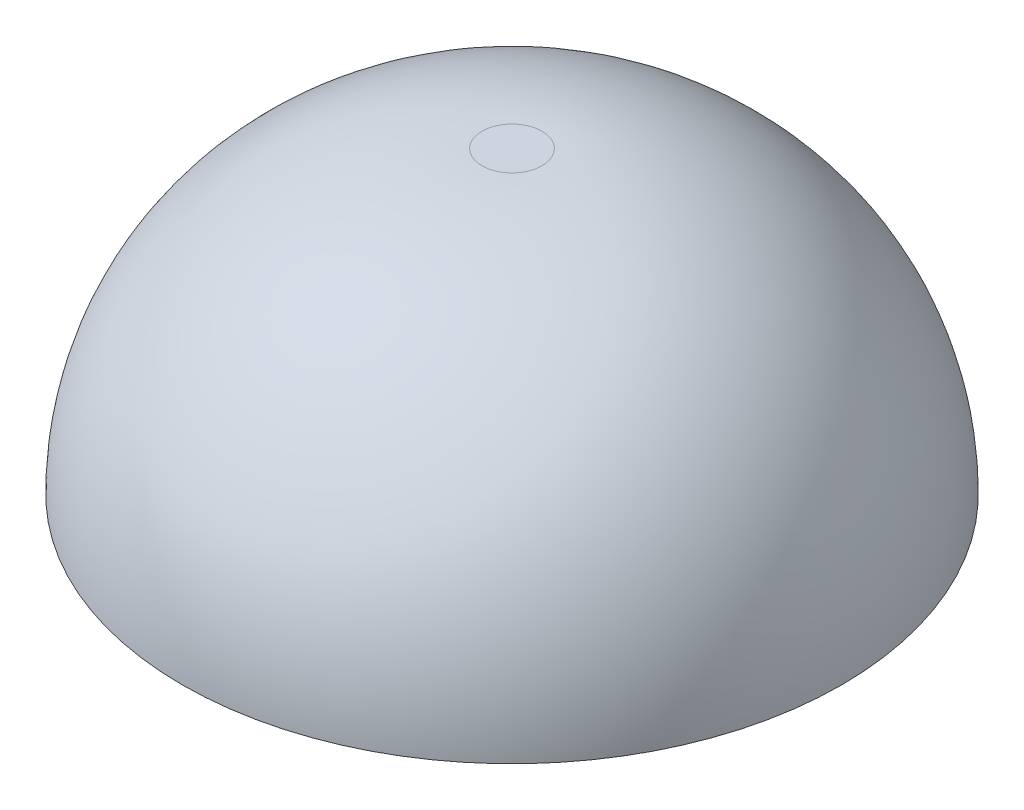
ISO-10303-21;
HEADER;
FILE_DESCRIPTION(('STEP AP214'),'2;1');
FILE_NAME('part.step','',(''),(''),'','','');
FILE_SCHEMA(('AUTOMOTIVE_DESIGN { 1 0 10303 214 1 1 1 1 }'));
ENDSEC;
DATA;
#1=APPLICATION_CONTEXT('core data for automotive mechanical design processes');
#2=APPLICATION_PROTOCOL_DEFINITION('international standard','automotive_design',2000,#1);
#3=PRODUCT_CONTEXT('',#1,'mechanical');
#4=PRODUCT('Part','Part','',(#3));
#5=PRODUCT_RELATED_PRODUCT_CATEGORY('part','',(#4));
#6=PRODUCT_DEFINITION_FORMATION('','',#4);
#7=PRODUCT_DEFINITION_CONTEXT('part definition',#1,'design');
#8=PRODUCT_DEFINITION('design','',#6,#7);
#9=PRODUCT_DEFINITION_SHAPE('','',#8);
#10=(LENGTH_UNIT() NAMED_UNIT(*) SI_UNIT(.MILLI.,.METRE.));
#11=(NAMED_UNIT(*) PLANE_ANGLE_UNIT() SI_UNIT($,.RADIAN.));
#12=(NAMED_UNIT(*) SI_UNIT($,.STERADIAN.) SOLID_ANGLE_UNIT());
#13=UNCERTAINTY_MEASURE_WITH_UNIT(LENGTH_MEASURE(1.E-05),#10,'distance_accuracy_value','');
#14=(GEOMETRIC_REPRESENTATION_CONTEXT(3) GLOBAL_UNCERTAINTY_ASSIGNED_CONTEXT((#13)) GLOBAL_UNIT_ASSIGNED_CONTEXT((#10,
#11,#12)) REPRESENTATION_CONTEXT('',''));
#15=CARTESIAN_POINT('',(0.,0.,0.));
#16=DIRECTION('',(0.,0.,1.));
#17=DIRECTION('',(1.,0.,0.));
#18=AXIS2_PLACEMENT_3D('',#15,#16,#17);
#19=CARTESIAN_POINT('',(0.,5.08,-0.507999999999999));
#20=DIRECTION('',(0.,1.,0.));
#21=DIRECTION('',(0.,0.,1.));
#22=AXIS2_PLACEMENT_3D('',#19,#20,#21);
#23=PLANE('',#22);
#24=CARTESIAN_POINT('',(0.,5.08,0.));
#25=DIRECTION('',(0.,-1.,0.));
#26=DIRECTION('',(0.,0.,-1.));
#27=AXIS2_PLACEMENT_3D('',#24,#25,#26);
#28=CIRCLE('',#27,0.507999999999999);
#29=CARTESIAN_POINT('',(0.,5.08,-0.507999999999999));
#30=VERTEX_POINT('',#29);
#31=CARTESIAN_POINT('',(0.,5.08,0.507999999999999));
#32=VERTEX_POINT('',#31);
#33=EDGE_CURVE('E31',#30,#32,#28,.T.);
#34=ORIENTED_EDGE('',*,*,#33,.F.);
#35=CARTESIAN_POINT('',(0.,5.08,0.));
#36=DIRECTION('',(0.,-1.,0.));
#37=DIRECTION('',(0.,0.,1.));
#38=AXIS2_PLACEMENT_3D('',#35,#36,#37);
#39=CIRCLE('',#38,0.507999999999999);
#40=EDGE_CURVE('E24',#32,#30,#39,.T.);
#41=ORIENTED_EDGE('',*,*,#40,.F.);
#42=EDGE_LOOP('',(#34,#41));
#43=FACE_BOUND('',#42,.T.);
#44=ADVANCED_FACE('F14',(#43),#23,.T.);
#45=CARTESIAN_POINT('',(0.,0.,-0.508));
#46=DIRECTION('',(1.,0.,0.));
#47=DIRECTION('',(0.,0.,-1.));
#48=AXIS2_PLACEMENT_3D('',#45,#46,#47);
#49=CIRCLE('',#48,5.08);
#50=TRIMMED_CURVE('',#49,(PARAMETER_VALUE(-1.67096374795646)),
(PARAMETER_VALUE(1.67096374795646)),.T.,.PARAMETER.);
#51=CARTESIAN_POINT('',(0.,0.,0.));
#52=DIRECTION('',(0.,-1.,0.));
#53=AXIS1_PLACEMENT('',#51,#52);
#54=SURFACE_OF_REVOLUTION('',#50,#53);
#55=ORIENTED_EDGE('',*,*,#33,.T.);
#56=ORIENTED_EDGE('',*,*,#40,.T.);
#57=EDGE_LOOP('',(#55,#56));
#58=FACE_BOUND('',#57,.T.);
#59=CARTESIAN_POINT('',(0.,0.,0.));
#60=DIRECTION('',(0.,-1.,0.));
#61=DIRECTION('',(0.,0.,-1.));
#62=AXIS2_PLACEMENT_3D('',#59,#60,#61);
#63=CIRCLE('',#62,5.588);
#64=CARTESIAN_POINT('',(0.,0.,-5.588));
#65=VERTEX_POINT('',#64);
#66=EDGE_CURVE('E9',#65,#65,#63,.T.);
#67=ORIENTED_EDGE('',*,*,#66,.F.);
#68=EDGE_LOOP('',(#67));
#69=FACE_BOUND('',#68,.T.);
#70=ADVANCED_FACE('F35',(#58,#69),#54,.F.);
#71=CARTESIAN_POINT('',(0.,0.,0.));
#72=DIRECTION('',(0.,-1.,0.));
#73=DIRECTION('',(0.,0.,-1.));
#74=AXIS2_PLACEMENT_3D('',#71,#72,#73);
#75=PLANE('',#74);
#76=ORIENTED_EDGE('',*,*,#66,.T.);
#77=EDGE_LOOP('',(#76));
#78=FACE_BOUND('',#77,.T.);
#79=ADVANCED_FACE('F62',(#78),#75,.T.);
#80=CLOSED_SHELL('',(#44,#70,#79));
#81=MANIFOLD_SOLID_BREP('B1',#80);
#82=ADVANCED_BREP_SHAPE_REPRESENTATION('',(#18,#81),#14);
#83=SHAPE_DEFINITION_REPRESENTATION(#9,#82);
ENDSEC;
END-ISO-10303-21;
